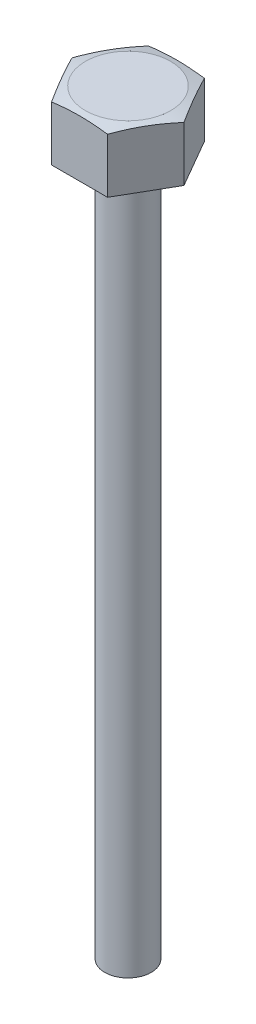
ISO-10303-21;
HEADER;
FILE_DESCRIPTION(('STEP AP214'),'2;1');
FILE_NAME('part.step','',(''),(''),'','','');
FILE_SCHEMA(('AUTOMOTIVE_DESIGN { 1 0 10303 214 1 1 1 1 }'));
ENDSEC;
DATA;
#1=APPLICATION_CONTEXT('core data for automotive mechanical design processes');
#2=APPLICATION_PROTOCOL_DEFINITION('international standard','automotive_design',2000,#1);
#3=PRODUCT_CONTEXT('',#1,'mechanical');
#4=PRODUCT('Part','Part','',(#3));
#5=PRODUCT_RELATED_PRODUCT_CATEGORY('part','',(#4));
#6=PRODUCT_DEFINITION_FORMATION('','',#4);
#7=PRODUCT_DEFINITION_CONTEXT('part definition',#1,'design');
#8=PRODUCT_DEFINITION('design','',#6,#7);
#9=PRODUCT_DEFINITION_SHAPE('','',#8);
#10=(LENGTH_UNIT() NAMED_UNIT(*) SI_UNIT(.MILLI.,.METRE.));
#11=(NAMED_UNIT(*) PLANE_ANGLE_UNIT() SI_UNIT($,.RADIAN.));
#12=(NAMED_UNIT(*) SI_UNIT($,.STERADIAN.) SOLID_ANGLE_UNIT());
#13=UNCERTAINTY_MEASURE_WITH_UNIT(LENGTH_MEASURE(1.E-05),#10,'distance_accuracy_value','');
#14=(GEOMETRIC_REPRESENTATION_CONTEXT(3) GLOBAL_UNCERTAINTY_ASSIGNED_CONTEXT((#13)) GLOBAL_UNIT_ASSIGNED_CONTEXT((#10,
#11,#12)) REPRESENTATION_CONTEXT('',''));
#15=CARTESIAN_POINT('',(0.,0.,0.));
#16=DIRECTION('',(0.,0.,1.));
#17=DIRECTION('',(1.,0.,0.));
#18=AXIS2_PLACEMENT_3D('',#15,#16,#17);
#19=CARTESIAN_POINT('',(7.21687836487029,-15.,-12.4999999999999));
#20=DIRECTION('',(0.,0.,-1.));
#21=DIRECTION('',(-1.,0.,0.));
#22=AXIS2_PLACEMENT_3D('',#19,#20,#21);
#23=PLANE('',#22);
#24=CARTESIAN_POINT('',(-19.0514379477862,-3.15808147244504,-12.4999999999999));
#25=CARTESIAN_POINT('',(-18.484789978601,-3.03116849697711,-12.4999999999999));
#26=CARTESIAN_POINT('',(-17.9177864760487,-2.90581438940561,-12.4999999999999));
#27=CARTESIAN_POINT('',(-16.7828938787969,-2.65906531006364,-12.4999999999999));
#28=CARTESIAN_POINT('',(-16.2150047466923,-2.5376705105381,-12.4999999999999));
#29=CARTESIAN_POINT('',(-15.0776525663566,-2.29957476052315,-12.4999999999999));
#30=CARTESIAN_POINT('',(-14.5081885163005,-2.18287857851869,-12.4999999999999));
#31=CARTESIAN_POINT('',(-13.368072193828,-1.95544601826615,-12.4999999999999));
#32=CARTESIAN_POINT('',(-12.7974199315692,-1.84470958928616,-12.4999999999999));
#33=CARTESIAN_POINT('',(-11.6593124207778,-1.63147579822966,-12.4999999999999));
#34=CARTESIAN_POINT('',(-11.091868281863,-1.52891943256883,-12.4999999999999));
#35=CARTESIAN_POINT('',(-9.95541533737928,-1.33280150597579,-12.4999999999999));
#36=CARTESIAN_POINT('',(-9.38640652598356,-1.2392399785867,-12.4999999999999));
#37=CARTESIAN_POINT('',(-8.24674011526302,-1.0632308409348,-12.4999999999999));
#38=CARTESIAN_POINT('',(-7.67608276103072,-0.980781657499073,-12.4999999999999));
#39=CARTESIAN_POINT('',(-6.5329534830442,-0.829432652510204,-12.4999999999999));
#40=CARTESIAN_POINT('',(-5.96048155781063,-0.760532842006353,-12.4999999999999));
#41=CARTESIAN_POINT('',(-4.80727825137422,-0.638241781553672,-12.4999999999999));
#42=CARTESIAN_POINT('',(-4.22652694047003,-0.585035673845357,-12.4999999999999));
#43=CARTESIAN_POINT('',(-3.06357297811869,-0.497808110638922,-12.4999999999999));
#44=CARTESIAN_POINT('',(-2.48137036026801,-0.463786215110459,-12.4999999999999));
#45=CARTESIAN_POINT('',(-1.31635795985752,-0.416911764020197,-12.4999999999999));
#46=CARTESIAN_POINT('',(-0.73354856738631,-0.404049708431425,-12.4999999999999));
#47=CARTESIAN_POINT('',(0.432142287019664,-0.40028469205677,-12.4999999999999));
#48=CARTESIAN_POINT('',(1.01502374891682,-0.409381719858817,-12.4999999999999));
#49=CARTESIAN_POINT('',(2.18217941682291,-0.449023763730301,-12.4999999999999));
#50=CARTESIAN_POINT('',(2.76645090451943,-0.479647214897937,-12.4999999999999));
#51=CARTESIAN_POINT('',(3.93361455472263,-0.560598599953175,-12.4999999999999));
#52=CARTESIAN_POINT('',(4.5165066866163,-0.610926967115073,-12.4999999999999));
#53=CARTESIAN_POINT('',(5.6809087016623,-0.728755877615253,-12.4999999999999));
#54=CARTESIAN_POINT('',(6.26241743965715,-0.796267564992388,-12.4999999999999));
#55=CARTESIAN_POINT('',(7.4235648680062,-0.945665954784517,-12.4999999999999));
#56=CARTESIAN_POINT('',(8.00320355279371,-1.02755269995041,-12.4999999999999));
#57=CARTESIAN_POINT('',(9.12426738535952,-1.19757230339902,-12.4999999999999));
#58=CARTESIAN_POINT('',(9.66580238655152,-1.28498807014144,-12.5));
#59=CARTESIAN_POINT('',(10.7474433290925,-1.46829355620316,-12.5));
#60=CARTESIAN_POINT('',(11.2875492308268,-1.56418350794457,-12.5));
#61=CARTESIAN_POINT('',(12.3665362180654,-1.76288660818732,-12.5));
#62=CARTESIAN_POINT('',(12.9054171740082,-1.86570045674129,-12.5));
#63=CARTESIAN_POINT('',(13.9820623693989,-2.0769724190702,-12.5));
#64=CARTESIAN_POINT('',(14.5198266189672,-2.18543048145907,-12.5));
#65=CARTESIAN_POINT('',(15.5945288327108,-2.406995512096,-12.5));
#66=CARTESIAN_POINT('',(16.1314665669322,-2.52010359267418,-12.5));
#67=CARTESIAN_POINT('',(17.2045233689518,-2.75013333424908,-12.5));
#68=CARTESIAN_POINT('',(17.7406424354323,-2.86705500137699,-12.5));
#69=CARTESIAN_POINT('',(19.3478878532561,-3.22251037725677,-12.5));
#70=CARTESIAN_POINT('',(20.4179732099357,-3.46574924831039,-12.5));
#71=CARTESIAN_POINT('',(22.5454562629865,-3.95850867879534,-12.5));
#72=CARTESIAN_POINT('',(23.6028741718402,-4.20794253978551,-12.5));
#73=CARTESIAN_POINT('',(25.7162404794343,-4.71303341521574,-12.5));
#74=CARTESIAN_POINT('',(26.7721888509209,-4.96869054348789,-12.5));
#75=CARTESIAN_POINT('',(28.8816548192617,-5.48429339413788,-12.5));
#76=CARTESIAN_POINT('',(29.9351738077114,-5.74423343427911,-12.5));
#77=CARTESIAN_POINT('',(31.5147829799061,-6.1367596369477,-12.5));
#78=CARTESIAN_POINT('',(32.0411993522196,-6.26803559446287,-12.5));
#79=CARTESIAN_POINT('',(33.0938382588567,-6.53136008653019,-12.5));
#80=CARTESIAN_POINT('',(33.6200607933873,-6.66340862025482,-12.5));
#81=CARTESIAN_POINT('',(34.1461987739313,-6.79579317382923,-12.5));
#82=B_SPLINE_CURVE_WITH_KNOTS('',3,(#24,#25,#26,#27,#28,#29,#30,#31,#32,#33,#34,#35,#36,#37,#38,
#39,#40,#41,#42,#43,#44,#45,#46,#47,#48,#49,#50,#51,#52,#53,#54,#55,#56,#57,#58,#59,#60,#61,#62,
#63,#64,#65,#66,#67,#68,#69,#70,#71,#72,#73,#74,#75,#76,#77,#78,#79,#80,#81),.UNSPECIFIED.,.F.,
.F.,(4,2,2,2,2,2,2,2,2,2,2,2,2,2,2,2,2,2,2,2,2,2,2,2,2,2,2,2,4),(0.,1.74206667585509,
3.48420903740606,5.22807703623814,6.9719301881912,8.70178444723387,10.4316451569155,
12.1612607126525,13.8908776788568,15.6401505392847,17.38938327482,19.1378304515898,
20.886276719697,22.6411269885517,24.3960158454529,26.1520457276755,27.9080808323554,
29.5536365527005,31.199237419842,32.8450049188426,34.4907574370617,36.1369059526317,
37.7830571148816,41.0751425096335,44.3344378049228,47.5937927620478,50.8491251398044,
52.4767389404375,54.1043509980332),.UNSPECIFIED.);
#83=CARTESIAN_POINT('',(7.2168783648703,-0.920072342738887,-12.4999999999999));
#84=VERTEX_POINT('',#83);
#85=CARTESIAN_POINT('',(-7.21687836487029,-0.920072342738886,-12.4999999999999));
#86=VERTEX_POINT('',#85);
#87=EDGE_CURVE('E54',#84,#86,#82,.F.);
#88=ORIENTED_EDGE('',*,*,#87,.F.);
#89=DIRECTION('',(0.,1.,0.));
#90=VECTOR('',#89,1.);
#91=CARTESIAN_POINT('',(7.21687836487029,-15.,-12.4999999999999));
#92=LINE('',#91,#90);
#93=CARTESIAN_POINT('',(7.21687836487029,-15.,-12.4999999999999));
#94=VERTEX_POINT('',#93);
#95=EDGE_CURVE('E46',#94,#84,#92,.T.);
#96=ORIENTED_EDGE('',*,*,#95,.F.);
#97=DIRECTION('',(-1.,0.,0.));
#98=VECTOR('',#97,1.);
#99=CARTESIAN_POINT('',(7.21687836487029,-15.,-12.4999999999999));
#100=LINE('',#99,#98);
#101=CARTESIAN_POINT('',(-7.21687836487029,-15.,-12.4999999999999));
#102=VERTEX_POINT('',#101);
#103=EDGE_CURVE('E133',#94,#102,#100,.T.);
#104=ORIENTED_EDGE('',*,*,#103,.T.);
#105=DIRECTION('',(0.,1.,0.));
#106=VECTOR('',#105,1.);
#107=CARTESIAN_POINT('',(-7.21687836487029,-15.,-12.4999999999999));
#108=LINE('',#107,#106);
#109=EDGE_CURVE('E41',#102,#86,#108,.T.);
#110=ORIENTED_EDGE('',*,*,#109,.T.);
#111=EDGE_LOOP('',(#88,#96,#104,#110));
#112=FACE_BOUND('',#111,.T.);
#113=ADVANCED_FACE('F37',(#112),#23,.T.);
#114=CARTESIAN_POINT('',(14.4337567297406,-15.,0.));
#115=DIRECTION('',(0.866025403784439,0.,-0.5));
#116=DIRECTION('',(-0.5,0.,-0.866025403784439));
#117=AXIS2_PLACEMENT_3D('',#114,#115,#116);
#118=PLANE('',#117);
#119=CARTESIAN_POINT('',(14.4338721997944,-0.920103283217841,0.000200000000000089));
#120=CARTESIAN_POINT('',(14.1341637857376,-0.839764338852158,-0.518910200602284));
#121=CARTESIAN_POINT('',(13.8339119805704,-0.766829942099494,-1.03896158221618));
#122=CARTESIAN_POINT('',(13.2323480500283,-0.638691175808711,-2.08090087391587));
#123=CARTESIAN_POINT('',(12.9310355440896,-0.583494007234341,-2.60278944315765));
#124=CARTESIAN_POINT('',(12.3291769952544,-0.494051953761175,-3.6452390287098));
#125=CARTESIAN_POINT('',(12.0286350217717,-0.459700409630138,-4.16579299658897));
#126=CARTESIAN_POINT('',(11.4271678243477,-0.413638517148966,-5.2075647416133));
#127=CARTESIAN_POINT('',(11.1262426858266,-0.401923788646655,-5.72878237080664));
#128=CARTESIAN_POINT('',(10.5243924087843,-0.401923788646655,-6.77121762919331));
#129=CARTESIAN_POINT('',(10.2234672702631,-0.413638517148966,-7.29243525838664));
#130=CARTESIAN_POINT('',(9.62200007283919,-0.459700409630138,-8.33420700341098));
#131=CARTESIAN_POINT('',(9.32145809935642,-0.494051953761176,-8.85476097129015));
#132=CARTESIAN_POINT('',(8.71959955052127,-0.583494007234342,-9.8972105568423));
#133=CARTESIAN_POINT('',(8.41828704458255,-0.638691175808712,-10.4190991260841));
#134=CARTESIAN_POINT('',(7.81672311404048,-0.766829942099495,-11.4610384177838));
#135=CARTESIAN_POINT('',(7.51647130887326,-0.839764338852158,-11.9810897993977));
#136=CARTESIAN_POINT('',(7.21676289481645,-0.920103283217841,-12.5001999999999));
#137=B_SPLINE_CURVE_WITH_KNOTS('',3,(#119,#120,#121,#122,#123,#124,#125,#126,#127,#128,#129,
#130,#131,#132,#133,#134,#135,#136),.UNSPECIFIED.,.F.,.F.,(4,2,2,2,2,2,2,2,4),(0.,
1.81442520948009,3.62958611178425,5.43537943855827,7.24082331503617,9.04626719151407,
10.8520605182881,12.6672214205922,14.4816466300723),.UNSPECIFIED.);
#138=CARTESIAN_POINT('',(14.4337567297406,-0.920072342738887,0.));
#139=VERTEX_POINT('',#138);
#140=EDGE_CURVE('E90',#139,#84,#137,.T.);
#141=ORIENTED_EDGE('',*,*,#140,.F.);
#142=DIRECTION('',(0.,1.,0.));
#143=VECTOR('',#142,1.);
#144=CARTESIAN_POINT('',(14.4337567297406,-15.,0.));
#145=LINE('',#144,#143);
#146=CARTESIAN_POINT('',(14.4337567297406,-15.,0.));
#147=VERTEX_POINT('',#146);
#148=EDGE_CURVE('E105',#147,#139,#145,.T.);
#149=ORIENTED_EDGE('',*,*,#148,.F.);
#150=DIRECTION('',(-0.5,0.,-0.866025403784439));
#151=VECTOR('',#150,1.);
#152=CARTESIAN_POINT('',(14.4337567297406,-15.,0.));
#153=LINE('',#152,#151);
#154=EDGE_CURVE('E104',#147,#94,#153,.T.);
#155=ORIENTED_EDGE('',*,*,#154,.T.);
#156=ORIENTED_EDGE('',*,*,#95,.T.);
#157=EDGE_LOOP('',(#141,#149,#155,#156));
#158=FACE_BOUND('',#157,.T.);
#159=ADVANCED_FACE('F102',(#158),#118,.T.);
#160=CARTESIAN_POINT('',(7.21687836487029,-15.,12.4999999999999));
#161=DIRECTION('',(0.866025403784439,0.,0.5));
#162=DIRECTION('',(0.5,0.,-0.866025403784439));
#163=AXIS2_PLACEMENT_3D('',#160,#161,#162);
#164=PLANE('',#163);
#165=CARTESIAN_POINT('',(7.21676289481645,-0.920103283217841,12.5001999999999));
#166=CARTESIAN_POINT('',(7.51647130887326,-0.839764338852157,11.9810897993977));
#167=CARTESIAN_POINT('',(7.81672311404049,-0.766829942099494,11.4610384177838));
#168=CARTESIAN_POINT('',(8.41828704458255,-0.638691175808711,10.4190991260841));
#169=CARTESIAN_POINT('',(8.71959955052128,-0.583494007234341,9.8972105568423));
#170=CARTESIAN_POINT('',(9.32145809935643,-0.494051953761175,8.85476097129014));
#171=CARTESIAN_POINT('',(9.62200007283919,-0.459700409630137,8.33420700341098));
#172=CARTESIAN_POINT('',(10.2234672702631,-0.413638517148965,7.29243525838664));
#173=CARTESIAN_POINT('',(10.5243924087843,-0.401923788646654,6.77121762919331));
#174=CARTESIAN_POINT('',(11.1262426858266,-0.401923788646654,5.72878237080663));
#175=CARTESIAN_POINT('',(11.4271678243477,-0.413638517148966,5.2075647416133));
#176=CARTESIAN_POINT('',(12.0286350217717,-0.459700409630138,4.16579299658896));
#177=CARTESIAN_POINT('',(12.3291769952544,-0.494051953761175,3.6452390287098));
#178=CARTESIAN_POINT('',(12.9310355440896,-0.583494007234341,2.60278944315764));
#179=CARTESIAN_POINT('',(13.2323480500283,-0.638691175808712,2.08090087391587));
#180=CARTESIAN_POINT('',(13.8339119805704,-0.766829942099495,1.03896158221618));
#181=CARTESIAN_POINT('',(14.1341637857376,-0.839764338852158,0.518910200602279));
#182=CARTESIAN_POINT('',(14.4338721997944,-0.920103283217841,-0.000200000000003467));
#183=B_SPLINE_CURVE_WITH_KNOTS('',3,(#165,#166,#167,#168,#169,#170,#171,#172,#173,#174,#175,
#176,#177,#178,#179,#180,#181,#182),.UNSPECIFIED.,.F.,.F.,(4,2,2,2,2,2,2,2,4),(0.,
1.81442520948009,3.62958611178425,5.43537943855827,7.24082331503617,9.04626719151407,
10.8520605182881,12.6672214205922,14.4816466300723),.UNSPECIFIED.);
#184=CARTESIAN_POINT('',(7.21687836487029,-0.920072342738887,12.4999999999999));
#185=VERTEX_POINT('',#184);
#186=EDGE_CURVE('E94',#185,#139,#183,.T.);
#187=ORIENTED_EDGE('',*,*,#186,.F.);
#188=DIRECTION('',(0.,1.,0.));
#189=VECTOR('',#188,1.);
#190=CARTESIAN_POINT('',(7.21687836487029,-15.,12.4999999999999));
#191=LINE('',#190,#189);
#192=CARTESIAN_POINT('',(7.21687836487029,-15.,12.4999999999999));
#193=VERTEX_POINT('',#192);
#194=EDGE_CURVE('E107',#193,#185,#191,.T.);
#195=ORIENTED_EDGE('',*,*,#194,.F.);
#196=DIRECTION('',(0.5,0.,-0.866025403784439));
#197=VECTOR('',#196,1.);
#198=CARTESIAN_POINT('',(7.21687836487029,-15.,12.4999999999999));
#199=LINE('',#198,#197);
#200=EDGE_CURVE('E120',#193,#147,#199,.T.);
#201=ORIENTED_EDGE('',*,*,#200,.T.);
#202=ORIENTED_EDGE('',*,*,#148,.T.);
#203=EDGE_LOOP('',(#187,#195,#201,#202));
#204=FACE_BOUND('',#203,.T.);
#205=ADVANCED_FACE('F184',(#204),#164,.T.);
#206=CARTESIAN_POINT('',(-7.21687836487029,-15.,12.4999999999999));
#207=DIRECTION('',(0.,0.,1.));
#208=DIRECTION('',(1.,0.,0.));
#209=AXIS2_PLACEMENT_3D('',#206,#207,#208);
#210=PLANE('',#209);
#211=CARTESIAN_POINT('',(-19.0514379477861,-3.15808147244504,12.4999999999999));
#212=CARTESIAN_POINT('',(-18.484789978601,-3.03116849697711,12.4999999999999));
#213=CARTESIAN_POINT('',(-17.9177864760487,-2.90581438940561,12.4999999999999));
#214=CARTESIAN_POINT('',(-16.7828938787969,-2.65906531006364,12.4999999999999));
#215=CARTESIAN_POINT('',(-16.2150047466923,-2.5376705105381,12.4999999999999));
#216=CARTESIAN_POINT('',(-15.0776525663566,-2.29957476052315,12.4999999999999));
#217=CARTESIAN_POINT('',(-14.5081885163005,-2.18287857851869,12.4999999999999));
#218=CARTESIAN_POINT('',(-13.368072193828,-1.95544601826615,12.4999999999999));
#219=CARTESIAN_POINT('',(-12.7974199315692,-1.84470958928616,12.4999999999999));
#220=CARTESIAN_POINT('',(-11.6593124207778,-1.63147579822966,12.4999999999999));
#221=CARTESIAN_POINT('',(-11.091868281863,-1.52891943256883,12.4999999999999));
#222=CARTESIAN_POINT('',(-9.95541533737927,-1.33280150597579,12.4999999999999));
#223=CARTESIAN_POINT('',(-9.38640652598355,-1.2392399785867,12.4999999999999));
#224=CARTESIAN_POINT('',(-8.24674011526302,-1.0632308409348,12.4999999999999));
#225=CARTESIAN_POINT('',(-7.67608276103071,-0.980781657499073,12.4999999999999));
#226=CARTESIAN_POINT('',(-6.5329534830442,-0.829432652510203,12.4999999999999));
#227=CARTESIAN_POINT('',(-5.96048155781062,-0.760532842006353,12.4999999999999));
#228=CARTESIAN_POINT('',(-4.80727825137422,-0.638241781553672,12.4999999999999));
#229=CARTESIAN_POINT('',(-4.22652694047003,-0.585035673845357,12.4999999999999));
#230=CARTESIAN_POINT('',(-3.06357297811868,-0.497808110638922,12.4999999999999));
#231=CARTESIAN_POINT('',(-2.48137036026801,-0.463786215110459,12.4999999999999));
#232=CARTESIAN_POINT('',(-1.31635795985752,-0.416911764020197,12.4999999999999));
#233=CARTESIAN_POINT('',(-0.733548567386309,-0.404049708431425,12.4999999999999));
#234=CARTESIAN_POINT('',(0.432142287019665,-0.40028469205677,12.4999999999999));
#235=CARTESIAN_POINT('',(1.01502374891682,-0.409381719858816,12.4999999999999));
#236=CARTESIAN_POINT('',(2.18217941682291,-0.4490237637303,12.4999999999999));
#237=CARTESIAN_POINT('',(2.76645090451943,-0.479647214897936,12.4999999999999));
#238=CARTESIAN_POINT('',(3.93361455472263,-0.560598599953175,12.4999999999999));
#239=CARTESIAN_POINT('',(4.5165066866163,-0.610926967115072,12.4999999999999));
#240=CARTESIAN_POINT('',(5.6809087016623,-0.728755877615252,12.4999999999999));
#241=CARTESIAN_POINT('',(6.26241743965715,-0.796267564992388,12.4999999999999));
#242=CARTESIAN_POINT('',(7.4235648680062,-0.945665954784517,12.4999999999999));
#243=CARTESIAN_POINT('',(8.00320355279371,-1.02755269995041,12.4999999999999));
#244=CARTESIAN_POINT('',(9.12426738535953,-1.19757230339902,12.4999999999999));
#245=CARTESIAN_POINT('',(9.66580238655152,-1.28498807014144,12.4999999999999));
#246=CARTESIAN_POINT('',(10.7474433290925,-1.46829355620316,12.4999999999999));
#247=CARTESIAN_POINT('',(11.2875492308268,-1.56418350794457,12.4999999999999));
#248=CARTESIAN_POINT('',(12.3665362180654,-1.76288660818732,12.4999999999999));
#249=CARTESIAN_POINT('',(12.9054171740082,-1.86570045674129,12.4999999999999));
#250=CARTESIAN_POINT('',(13.9820623693989,-2.0769724190702,12.4999999999999));
#251=CARTESIAN_POINT('',(14.5198266189672,-2.18543048145907,12.4999999999999));
#252=CARTESIAN_POINT('',(15.5945288327108,-2.406995512096,12.4999999999999));
#253=CARTESIAN_POINT('',(16.1314665669322,-2.52010359267418,12.4999999999999));
#254=CARTESIAN_POINT('',(17.2045233689518,-2.75013333424908,12.4999999999999));
#255=CARTESIAN_POINT('',(17.7406424354323,-2.86705500137699,12.4999999999999));
#256=CARTESIAN_POINT('',(19.3478878532562,-3.22251037725677,12.4999999999999));
#257=CARTESIAN_POINT('',(20.4179732099357,-3.46574924831039,12.4999999999999));
#258=CARTESIAN_POINT('',(22.5454562629865,-3.95850867879535,12.4999999999999));
#259=CARTESIAN_POINT('',(23.6028741718402,-4.20794253978551,12.4999999999999));
#260=CARTESIAN_POINT('',(25.7162404794343,-4.71303341521574,12.4999999999999));
#261=CARTESIAN_POINT('',(26.7721888509209,-4.96869054348789,12.4999999999999));
#262=CARTESIAN_POINT('',(28.8816548192617,-5.48429339413788,12.4999999999999));
#263=CARTESIAN_POINT('',(29.9351738077114,-5.74423343427911,12.4999999999999));
#264=CARTESIAN_POINT('',(31.5147829799061,-6.1367596369477,12.4999999999999));
#265=CARTESIAN_POINT('',(32.0411993522196,-6.26803559446287,12.4999999999999));
#266=CARTESIAN_POINT('',(33.0938382588567,-6.53136008653019,12.4999999999999));
#267=CARTESIAN_POINT('',(33.6200607933873,-6.66340862025482,12.4999999999999));
#268=CARTESIAN_POINT('',(34.1461987739313,-6.79579317382923,12.4999999999999));
#269=B_SPLINE_CURVE_WITH_KNOTS('',3,(#211,#212,#213,#214,#215,#216,#217,#218,#219,#220,#221,
#222,#223,#224,#225,#226,#227,#228,#229,#230,#231,#232,#233,#234,#235,#236,#237,#238,#239,#240,
#241,#242,#243,#244,#245,#246,#247,#248,#249,#250,#251,#252,#253,#254,#255,#256,#257,#258,#259,
#260,#261,#262,#263,#264,#265,#266,#267,#268),.UNSPECIFIED.,.F.,.F.,(4,2,2,2,2,2,2,2,2,2,2,2,2,
2,2,2,2,2,2,2,2,2,2,2,2,2,2,2,4),(0.,1.74206667585509,3.48420903740606,5.22807703623814,
6.9719301881912,8.70178444723387,10.4316451569155,12.1612607126525,13.8908776788568,
15.6401505392847,17.38938327482,19.1378304515898,20.886276719697,22.6411269885517,
24.3960158454529,26.1520457276755,27.9080808323554,29.5536365527005,31.199237419842,
32.8450049188426,34.4907574370617,36.1369059526317,37.7830571148816,41.0751425096335,
44.3344378049228,47.5937927620478,50.8491251398044,52.4767389404375,54.1043509980332),.UNSPECIFIED.);
#270=CARTESIAN_POINT('',(-7.21687836487028,-0.920072342738887,12.4999999999999));
#271=VERTEX_POINT('',#270);
#272=EDGE_CURVE('E173',#271,#185,#269,.T.);
#273=ORIENTED_EDGE('',*,*,#272,.F.);
#274=DIRECTION('',(0.,1.,0.));
#275=VECTOR('',#274,1.);
#276=CARTESIAN_POINT('',(-7.21687836487029,-15.,12.4999999999999));
#277=LINE('',#276,#275);
#278=CARTESIAN_POINT('',(-7.21687836487029,-15.,12.4999999999999));
#279=VERTEX_POINT('',#278);
#280=EDGE_CURVE('E114',#279,#271,#277,.T.);
#281=ORIENTED_EDGE('',*,*,#280,.F.);
#282=DIRECTION('',(1.,0.,0.));
#283=VECTOR('',#282,1.);
#284=CARTESIAN_POINT('',(-7.21687836487029,-15.,12.4999999999999));
#285=LINE('',#284,#283);
#286=EDGE_CURVE('E122',#279,#193,#285,.T.);
#287=ORIENTED_EDGE('',*,*,#286,.T.);
#288=ORIENTED_EDGE('',*,*,#194,.T.);
#289=EDGE_LOOP('',(#273,#281,#287,#288));
#290=FACE_BOUND('',#289,.T.);
#291=ADVANCED_FACE('F187',(#290),#210,.T.);
#292=CARTESIAN_POINT('',(-14.4337567297406,-15.,0.));
#293=DIRECTION('',(-0.866025403784438,0.,0.5));
#294=DIRECTION('',(0.5,0.,0.866025403784439));
#295=AXIS2_PLACEMENT_3D('',#292,#293,#294);
#296=PLANE('',#295);
#297=CARTESIAN_POINT('',(-14.4338721997944,-0.92010328321784,-0.000199999999995287));
#298=CARTESIAN_POINT('',(-14.1341637857376,-0.839764338852156,0.518910200602287));
#299=CARTESIAN_POINT('',(-13.8339119805704,-0.766829942099493,1.03896158221619));
#300=CARTESIAN_POINT('',(-13.2323480500283,-0.638691175808711,2.08090087391588));
#301=CARTESIAN_POINT('',(-12.9310355440896,-0.583494007234341,2.60278944315765));
#302=CARTESIAN_POINT('',(-12.3291769952544,-0.494051953761175,3.6452390287098));
#303=CARTESIAN_POINT('',(-12.0286350217717,-0.459700409630137,4.16579299658897));
#304=CARTESIAN_POINT('',(-11.4271678243477,-0.413638517148965,5.2075647416133));
#305=CARTESIAN_POINT('',(-11.1262426858266,-0.401923788646653,5.72878237080664));
#306=CARTESIAN_POINT('',(-10.5243924087843,-0.401923788646654,6.77121762919331));
#307=CARTESIAN_POINT('',(-10.2234672702631,-0.413638517148965,7.29243525838664));
#308=CARTESIAN_POINT('',(-9.62200007283919,-0.459700409630137,8.33420700341098));
#309=CARTESIAN_POINT('',(-9.32145809935642,-0.494051953761175,8.85476097129015));
#310=CARTESIAN_POINT('',(-8.71959955052127,-0.58349400723434,9.8972105568423));
#311=CARTESIAN_POINT('',(-8.41828704458255,-0.638691175808711,10.4190991260841));
#312=CARTESIAN_POINT('',(-7.81672311404048,-0.766829942099494,11.4610384177838));
#313=CARTESIAN_POINT('',(-7.51647130887326,-0.839764338852157,11.9810897993977));
#314=CARTESIAN_POINT('',(-7.21676289481645,-0.92010328321784,12.5001999999999));
#315=B_SPLINE_CURVE_WITH_KNOTS('',3,(#297,#298,#299,#300,#301,#302,#303,#304,#305,#306,#307,
#308,#309,#310,#311,#312,#313,#314),.UNSPECIFIED.,.F.,.F.,(4,2,2,2,2,2,2,2,4),(0.,
1.81442520948009,3.62958611178425,5.43537943855826,7.24082331503616,9.04626719151406,
10.8520605182881,12.6672214205922,14.4816466300723),.UNSPECIFIED.);
#316=CARTESIAN_POINT('',(-14.4337567297406,-0.920072342738887,0.));
#317=VERTEX_POINT('',#316);
#318=EDGE_CURVE('E165',#317,#271,#315,.T.);
#319=ORIENTED_EDGE('',*,*,#318,.F.);
#320=DIRECTION('',(0.,1.,0.));
#321=VECTOR('',#320,1.);
#322=CARTESIAN_POINT('',(-14.4337567297406,-15.,0.));
#323=LINE('',#322,#321);
#324=CARTESIAN_POINT('',(-14.4337567297406,-15.,0.));
#325=VERTEX_POINT('',#324);
#326=EDGE_CURVE('E116',#325,#317,#323,.T.);
#327=ORIENTED_EDGE('',*,*,#326,.F.);
#328=DIRECTION('',(0.5,0.,0.866025403784438));
#329=VECTOR('',#328,1.);
#330=CARTESIAN_POINT('',(-14.4337567297406,-15.,0.));
#331=LINE('',#330,#329);
#332=EDGE_CURVE('E126',#325,#279,#331,.T.);
#333=ORIENTED_EDGE('',*,*,#332,.T.);
#334=ORIENTED_EDGE('',*,*,#280,.T.);
#335=EDGE_LOOP('',(#319,#327,#333,#334));
#336=FACE_BOUND('',#335,.T.);
#337=ADVANCED_FACE('F192',(#336),#296,.T.);
#338=CARTESIAN_POINT('',(-7.21687836487029,-15.,-12.4999999999999));
#339=DIRECTION('',(-0.866025403784439,0.,-0.5));
#340=DIRECTION('',(-0.5,0.,0.866025403784439));
#341=AXIS2_PLACEMENT_3D('',#338,#339,#340);
#342=PLANE('',#341);
#343=CARTESIAN_POINT('',(-7.21676289481645,-0.92010328321784,-12.5001999999999));
#344=CARTESIAN_POINT('',(-7.51647130887326,-0.839764338852157,-11.9810897993977));
#345=CARTESIAN_POINT('',(-7.81672311404048,-0.766829942099493,-11.4610384177838));
#346=CARTESIAN_POINT('',(-8.41828704458255,-0.63869117580871,-10.4190991260841));
#347=CARTESIAN_POINT('',(-8.71959955052127,-0.58349400723434,-9.89721055684229));
#348=CARTESIAN_POINT('',(-9.32145809935642,-0.494051953761175,-8.85476097129014));
#349=CARTESIAN_POINT('',(-9.62200007283919,-0.459700409630137,-8.33420700341098));
#350=CARTESIAN_POINT('',(-10.2234672702631,-0.413638517148965,-7.29243525838664));
#351=CARTESIAN_POINT('',(-10.5243924087843,-0.401923788646654,-6.7712176291933));
#352=CARTESIAN_POINT('',(-11.1262426858266,-0.401923788646653,-5.72878237080663));
#353=CARTESIAN_POINT('',(-11.4271678243477,-0.413638517148964,-5.2075647416133));
#354=CARTESIAN_POINT('',(-12.0286350217717,-0.459700409630136,-4.16579299658896));
#355=CARTESIAN_POINT('',(-12.3291769952544,-0.494051953761174,-3.6452390287098));
#356=CARTESIAN_POINT('',(-12.9310355440896,-0.58349400723434,-2.60278944315764));
#357=CARTESIAN_POINT('',(-13.2323480500283,-0.63869117580871,-2.08090087391587));
#358=CARTESIAN_POINT('',(-13.8339119805704,-0.766829942099494,-1.03896158221618));
#359=CARTESIAN_POINT('',(-14.1341637857376,-0.839764338852157,-0.518910200602277));
#360=CARTESIAN_POINT('',(-14.4338721997944,-0.92010328321784,0.000200000000006602));
#361=B_SPLINE_CURVE_WITH_KNOTS('',3,(#343,#344,#345,#346,#347,#348,#349,#350,#351,#352,#353,
#354,#355,#356,#357,#358,#359,#360),.UNSPECIFIED.,.F.,.F.,(4,2,2,2,2,2,2,2,4),(0.,
1.81442520948009,3.62958611178425,5.43537943855826,7.24082331503616,9.04626719151406,
10.8520605182881,12.6672214205922,14.4816466300723),.UNSPECIFIED.);
#362=EDGE_CURVE('E156',#86,#317,#361,.T.);
#363=ORIENTED_EDGE('',*,*,#362,.F.);
#364=ORIENTED_EDGE('',*,*,#109,.F.);
#365=DIRECTION('',(-0.5,0.,0.866025403784439));
#366=VECTOR('',#365,1.);
#367=CARTESIAN_POINT('',(-7.21687836487029,-15.,-12.4999999999999));
#368=LINE('',#367,#366);
#369=EDGE_CURVE('E131',#102,#325,#368,.T.);
#370=ORIENTED_EDGE('',*,*,#369,.T.);
#371=ORIENTED_EDGE('',*,*,#326,.T.);
#372=EDGE_LOOP('',(#363,#364,#370,#371));
#373=FACE_BOUND('',#372,.T.);
#374=ADVANCED_FACE('F196',(#373),#342,.T.);
#375=CARTESIAN_POINT('',(0.,-15.,0.));
#376=DIRECTION('',(0.,1.,0.));
#377=DIRECTION('',(0.,0.,1.));
#378=AXIS2_PLACEMENT_3D('',#375,#376,#377);
#379=PLANE('',#378);
#380=CARTESIAN_POINT('',(0.,-15.,0.));
#381=DIRECTION('',(0.,-1.,0.));
#382=DIRECTION('',(0.,0.,-1.));
#383=AXIS2_PLACEMENT_3D('',#380,#381,#382);
#384=CIRCLE('',#383,6.);
#385=CARTESIAN_POINT('',(0.,-15.,6.));
#386=VERTEX_POINT('',#385);
#387=EDGE_CURVE('E11',#386,#386,#384,.T.);
#388=ORIENTED_EDGE('',*,*,#387,.F.);
#389=EDGE_LOOP('',(#388));
#390=FACE_BOUND('',#389,.T.);
#391=ORIENTED_EDGE('',*,*,#103,.F.);
#392=ORIENTED_EDGE('',*,*,#154,.F.);
#393=ORIENTED_EDGE('',*,*,#200,.F.);
#394=ORIENTED_EDGE('',*,*,#286,.F.);
#395=ORIENTED_EDGE('',*,*,#332,.F.);
#396=ORIENTED_EDGE('',*,*,#369,.F.);
#397=EDGE_LOOP('',(#391,#392,#393,#394,#395,#396));
#398=FACE_BOUND('',#397,.T.);
#399=ADVANCED_FACE('F200',(#390,#398),#379,.F.);
#400=CARTESIAN_POINT('',(0.,-195.,0.));
#401=DIRECTION('',(0.,1.,0.));
#402=DIRECTION('',(0.,0.,1.));
#403=AXIS2_PLACEMENT_3D('',#400,#401,#402);
#404=CYLINDRICAL_SURFACE('',#403,6.);
#405=CARTESIAN_POINT('',(0.,-195.,0.));
#406=DIRECTION('',(0.,-1.,0.));
#407=DIRECTION('',(0.,0.,-1.));
#408=AXIS2_PLACEMENT_3D('',#405,#406,#407);
#409=CIRCLE('',#408,6.);
#410=CARTESIAN_POINT('',(0.,-195.,6.));
#411=VERTEX_POINT('',#410);
#412=EDGE_CURVE('E99',#411,#411,#409,.T.);
#413=CARTESIAN_POINT('',(0.,-195.,6.));
#414=CARTESIAN_POINT('',(0.,-193.125,6.));
#415=CARTESIAN_POINT('',(0.,-191.25,6.));
#416=CARTESIAN_POINT('',(0.,-187.5,6.));
#417=CARTESIAN_POINT('',(0.,-185.625,6.));
#418=CARTESIAN_POINT('',(0.,-181.875,6.));
#419=CARTESIAN_POINT('',(0.,-180.,6.));
#420=CARTESIAN_POINT('',(0.,-176.25,6.));
#421=CARTESIAN_POINT('',(0.,-174.375,6.));
#422=CARTESIAN_POINT('',(0.,-170.625,6.));
#423=CARTESIAN_POINT('',(0.,-168.75,6.));
#424=CARTESIAN_POINT('',(0.,-165.,6.));
#425=CARTESIAN_POINT('',(0.,-163.125,6.));
#426=CARTESIAN_POINT('',(0.,-159.375,6.));
#427=CARTESIAN_POINT('',(0.,-157.5,6.));
#428=CARTESIAN_POINT('',(0.,-153.75,6.));
#429=CARTESIAN_POINT('',(0.,-151.875,6.));
#430=CARTESIAN_POINT('',(0.,-148.125,6.));
#431=CARTESIAN_POINT('',(0.,-146.25,6.));
#432=CARTESIAN_POINT('',(0.,-142.5,6.));
#433=CARTESIAN_POINT('',(0.,-140.625,6.));
#434=CARTESIAN_POINT('',(0.,-136.875,6.));
#435=CARTESIAN_POINT('',(0.,-135.,6.));
#436=CARTESIAN_POINT('',(0.,-131.25,6.));
#437=CARTESIAN_POINT('',(0.,-129.375,6.));
#438=CARTESIAN_POINT('',(0.,-125.625,6.));
#439=CARTESIAN_POINT('',(0.,-123.75,6.));
#440=CARTESIAN_POINT('',(0.,-120.,6.));
#441=CARTESIAN_POINT('',(0.,-118.125,6.));
#442=CARTESIAN_POINT('',(0.,-114.375,6.));
#443=CARTESIAN_POINT('',(0.,-112.5,6.));
#444=CARTESIAN_POINT('',(0.,-108.75,6.));
#445=CARTESIAN_POINT('',(0.,-106.875,6.));
#446=CARTESIAN_POINT('',(0.,-103.125,6.));
#447=CARTESIAN_POINT('',(0.,-101.25,6.));
#448=CARTESIAN_POINT('',(0.,-97.5,6.));
#449=CARTESIAN_POINT('',(0.,-95.625,6.));
#450=CARTESIAN_POINT('',(0.,-91.875,6.));
#451=CARTESIAN_POINT('',(0.,-90.,6.));
#452=CARTESIAN_POINT('',(0.,-86.25,6.));
#453=CARTESIAN_POINT('',(0.,-84.375,6.));
#454=CARTESIAN_POINT('',(0.,-80.625,6.));
#455=CARTESIAN_POINT('',(0.,-78.75,6.));
#456=CARTESIAN_POINT('',(0.,-75.,6.));
#457=CARTESIAN_POINT('',(0.,-73.125,6.));
#458=CARTESIAN_POINT('',(0.,-69.375,6.));
#459=CARTESIAN_POINT('',(0.,-67.5,6.));
#460=CARTESIAN_POINT('',(0.,-63.75,6.));
#461=CARTESIAN_POINT('',(0.,-61.875,6.));
#462=CARTESIAN_POINT('',(0.,-58.125,6.));
#463=CARTESIAN_POINT('',(0.,-56.25,6.));
#464=CARTESIAN_POINT('',(0.,-52.5,6.));
#465=CARTESIAN_POINT('',(0.,-50.625,6.));
#466=CARTESIAN_POINT('',(0.,-46.875,6.));
#467=CARTESIAN_POINT('',(0.,-45.,6.));
#468=CARTESIAN_POINT('',(0.,-41.25,6.));
#469=CARTESIAN_POINT('',(0.,-39.375,6.));
#470=CARTESIAN_POINT('',(0.,-35.625,6.));
#471=CARTESIAN_POINT('',(0.,-33.75,6.));
#472=CARTESIAN_POINT('',(0.,-30.,6.));
#473=CARTESIAN_POINT('',(0.,-28.125,6.));
#474=CARTESIAN_POINT('',(0.,-24.375,6.));
#475=CARTESIAN_POINT('',(0.,-22.5,6.));
#476=CARTESIAN_POINT('',(0.,-18.75,6.));
#477=CARTESIAN_POINT('',(0.,-16.875,6.));
#478=CARTESIAN_POINT('',(0.,-15.,6.));
#479=B_SPLINE_CURVE_WITH_KNOTS('',3,(#413,#414,#415,#416,#417,#418,#419,#420,#421,#422,#423,
#424,#425,#426,#427,#428,#429,#430,#431,#432,#433,#434,#435,#436,#437,#438,#439,#440,#441,#442,
#443,#444,#445,#446,#447,#448,#449,#450,#451,#452,#453,#454,#455,#456,#457,#458,#459,#460,#461,
#462,#463,#464,#465,#466,#467,#468,#469,#470,#471,#472,#473,#474,#475,#476,#477,#478),
.UNSPECIFIED.,.F.,.F.,(4,2,2,2,2,2,2,2,2,2,2,2,2,2,2,2,2,2,2,2,2,2,2,2,2,2,2,2,2,2,2,2,4),(0.,
5.62499999999999,11.25,16.875,22.5,28.125,33.75,39.375,45.,50.625,56.25,61.875,67.5,73.125,
78.75,84.375,90.,95.625,101.25,106.875,112.5,118.125,123.75,129.375,135.,140.625,146.25,151.875,
157.5,163.125,168.75,174.375,180.),.UNSPECIFIED.);
#480=EDGE_CURVE('BSEAM204',#411,#386,#479,.T.);
#481=ORIENTED_EDGE('',*,*,#412,.F.);
#482=ORIENTED_EDGE('',*,*,#387,.T.);
#483=ORIENTED_EDGE('',*,*,#480,.T.);
#484=ORIENTED_EDGE('',*,*,#480,.F.);
#485=EDGE_LOOP('',(#481,#483,#482,#484));
#486=FACE_BOUND('',#485,.T.);
#487=ADVANCED_FACE('F204',(#486),#404,.T.);
#488=CARTESIAN_POINT('',(0.,-195.,0.));
#489=DIRECTION('',(0.,-1.,0.));
#490=DIRECTION('',(0.,0.,-1.));
#491=AXIS2_PLACEMENT_3D('',#488,#489,#490);
#492=PLANE('',#491);
#493=ORIENTED_EDGE('',*,*,#412,.T.);
#494=EDGE_LOOP('',(#493));
#495=FACE_BOUND('',#494,.T.);
#496=ADVANCED_FACE('F151',(#495),#492,.T.);
#497=CARTESIAN_POINT('',(0.,0.,0.));
#498=DIRECTION('',(0.,-1.,0.));
#499=DIRECTION('',(0.,0.,-1.));
#500=AXIS2_PLACEMENT_3D('',#497,#498,#499);
#501=CONICAL_SURFACE('',#500,11.,1.30899693899576);
#502=ORIENTED_EDGE('',*,*,#87,.T.);
#503=ORIENTED_EDGE('',*,*,#362,.T.);
#504=ORIENTED_EDGE('',*,*,#318,.T.);
#505=ORIENTED_EDGE('',*,*,#272,.T.);
#506=ORIENTED_EDGE('',*,*,#186,.T.);
#507=ORIENTED_EDGE('',*,*,#140,.T.);
#508=EDGE_LOOP('',(#502,#503,#504,#505,#506,#507));
#509=FACE_BOUND('',#508,.T.);
#510=CARTESIAN_POINT('',(0.,0.,0.));
#511=DIRECTION('',(0.,-1.,0.));
#512=DIRECTION('',(0.,0.,-1.));
#513=AXIS2_PLACEMENT_3D('',#510,#511,#512);
#514=CIRCLE('',#513,11.);
#515=CARTESIAN_POINT('',(0.,0.,-11.));
#516=VERTEX_POINT('',#515);
#517=EDGE_CURVE('E277',#516,#516,#514,.T.);
#518=ORIENTED_EDGE('',*,*,#517,.T.);
#519=EDGE_LOOP('',(#518));
#520=FACE_BOUND('',#519,.T.);
#521=ADVANCED_FACE('F91',(#509,#520),#501,.T.);
#522=CARTESIAN_POINT('',(0.,0.,0.));
#523=DIRECTION('',(0.,1.,0.));
#524=DIRECTION('',(0.,0.,1.));
#525=AXIS2_PLACEMENT_3D('',#522,#523,#524);
#526=PLANE('',#525);
#527=ORIENTED_EDGE('',*,*,#517,.F.);
#528=EDGE_LOOP('',(#527));
#529=FACE_BOUND('',#528,.T.);
#530=ADVANCED_FACE('F150',(#529),#526,.T.);
#531=CLOSED_SHELL('',(#113,#159,#205,#291,#337,#374,#399,#487,#496,#521,#530));
#532=MANIFOLD_SOLID_BREP('B2',#531);
#533=ADVANCED_BREP_SHAPE_REPRESENTATION('',(#18,#532),#14);
#534=SHAPE_DEFINITION_REPRESENTATION(#9,#533);
ENDSEC;
END-ISO-10303-21;
